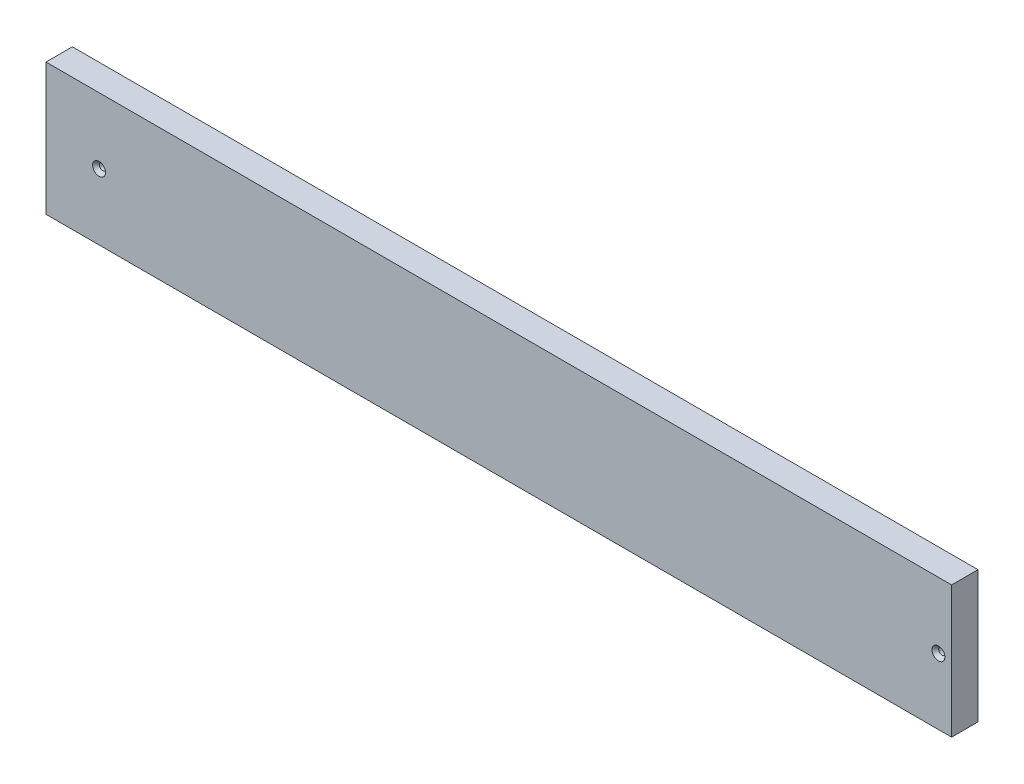
ISO-10303-21;
HEADER;
FILE_DESCRIPTION(('STEP AP214'),'2;1');
FILE_NAME('part.step','',(''),(''),'','','');
FILE_SCHEMA(('AUTOMOTIVE_DESIGN { 1 0 10303 214 1 1 1 1 }'));
ENDSEC;
DATA;
#1=APPLICATION_CONTEXT('core data for automotive mechanical design processes');
#2=APPLICATION_PROTOCOL_DEFINITION('international standard','automotive_design',2000,#1);
#3=PRODUCT_CONTEXT('',#1,'mechanical');
#4=PRODUCT('Part','Part','',(#3));
#5=PRODUCT_RELATED_PRODUCT_CATEGORY('part','',(#4));
#6=PRODUCT_DEFINITION_FORMATION('','',#4);
#7=PRODUCT_DEFINITION_CONTEXT('part definition',#1,'design');
#8=PRODUCT_DEFINITION('design','',#6,#7);
#9=PRODUCT_DEFINITION_SHAPE('','',#8);
#10=(LENGTH_UNIT() NAMED_UNIT(*) SI_UNIT(.MILLI.,.METRE.));
#11=(NAMED_UNIT(*) PLANE_ANGLE_UNIT() SI_UNIT($,.RADIAN.));
#12=(NAMED_UNIT(*) SI_UNIT($,.STERADIAN.) SOLID_ANGLE_UNIT());
#13=UNCERTAINTY_MEASURE_WITH_UNIT(LENGTH_MEASURE(1.E-05),#10,'distance_accuracy_value','');
#14=(GEOMETRIC_REPRESENTATION_CONTEXT(3) GLOBAL_UNCERTAINTY_ASSIGNED_CONTEXT((#13)) GLOBAL_UNIT_ASSIGNED_CONTEXT((#10,
#11,#12)) REPRESENTATION_CONTEXT('',''));
#15=CARTESIAN_POINT('',(0.,0.,0.));
#16=DIRECTION('',(0.,0.,1.));
#17=DIRECTION('',(1.,0.,0.));
#18=AXIS2_PLACEMENT_3D('',#15,#16,#17);
#19=CARTESIAN_POINT('',(0.,0.,15.));
#20=DIRECTION('',(1.,0.,0.));
#21=DIRECTION('',(0.,0.,-1.));
#22=AXIS2_PLACEMENT_3D('',#19,#20,#21);
#23=PLANE('',#22);
#24=DIRECTION('',(0.,-1.,0.));
#25=VECTOR('',#24,1.);
#26=CARTESIAN_POINT('',(0.,0.,0.));
#27=LINE('',#26,#25);
#28=CARTESIAN_POINT('',(0.,75.,0.));
#29=VERTEX_POINT('',#28);
#30=CARTESIAN_POINT('',(0.,0.,0.));
#31=VERTEX_POINT('',#30);
#32=EDGE_CURVE('E109',#29,#31,#27,.T.);
#33=ORIENTED_EDGE('',*,*,#32,.T.);
#34=DIRECTION('',(0.,0.,-1.));
#35=VECTOR('',#34,1.);
#36=CARTESIAN_POINT('',(0.,0.,15.));
#37=LINE('',#36,#35);
#38=CARTESIAN_POINT('',(0.,0.,15.));
#39=VERTEX_POINT('',#38);
#40=EDGE_CURVE('E11',#39,#31,#37,.T.);
#41=ORIENTED_EDGE('',*,*,#40,.F.);
#42=DIRECTION('',(0.,-1.,0.));
#43=VECTOR('',#42,1.);
#44=CARTESIAN_POINT('',(0.,0.,15.));
#45=LINE('',#44,#43);
#46=CARTESIAN_POINT('',(0.,75.,15.));
#47=VERTEX_POINT('',#46);
#48=EDGE_CURVE('E96',#47,#39,#45,.T.);
#49=ORIENTED_EDGE('',*,*,#48,.F.);
#50=DIRECTION('',(0.,0.,-1.));
#51=VECTOR('',#50,1.);
#52=CARTESIAN_POINT('',(0.,75.,15.));
#53=LINE('',#52,#51);
#54=EDGE_CURVE('E106',#47,#29,#53,.T.);
#55=ORIENTED_EDGE('',*,*,#54,.T.);
#56=EDGE_LOOP('',(#33,#41,#49,#55));
#57=FACE_BOUND('',#56,.T.);
#58=ADVANCED_FACE('F50',(#57),#23,.F.);
#59=CARTESIAN_POINT('',(0.,0.,15.));
#60=DIRECTION('',(0.,1.,0.));
#61=DIRECTION('',(0.,0.,1.));
#62=AXIS2_PLACEMENT_3D('',#59,#60,#61);
#63=PLANE('',#62);
#64=DIRECTION('',(1.,0.,0.));
#65=VECTOR('',#64,1.);
#66=CARTESIAN_POINT('',(0.,0.,0.));
#67=LINE('',#66,#65);
#68=CARTESIAN_POINT('',(515.,0.,0.));
#69=VERTEX_POINT('',#68);
#70=EDGE_CURVE('E105',#31,#69,#67,.T.);
#71=ORIENTED_EDGE('',*,*,#70,.T.);
#72=DIRECTION('',(0.,0.,-1.));
#73=VECTOR('',#72,1.);
#74=CARTESIAN_POINT('',(515.,0.,15.));
#75=LINE('',#74,#73);
#76=CARTESIAN_POINT('',(515.,0.,15.));
#77=VERTEX_POINT('',#76);
#78=EDGE_CURVE('E54',#77,#69,#75,.T.);
#79=ORIENTED_EDGE('',*,*,#78,.F.);
#80=DIRECTION('',(1.,0.,0.));
#81=VECTOR('',#80,1.);
#82=CARTESIAN_POINT('',(0.,0.,15.));
#83=LINE('',#82,#81);
#84=EDGE_CURVE('E94',#39,#77,#83,.T.);
#85=ORIENTED_EDGE('',*,*,#84,.F.);
#86=ORIENTED_EDGE('',*,*,#40,.T.);
#87=EDGE_LOOP('',(#71,#79,#85,#86));
#88=FACE_BOUND('',#87,.T.);
#89=ADVANCED_FACE('F103',(#88),#63,.F.);
#90=CARTESIAN_POINT('',(515.,0.,15.));
#91=DIRECTION('',(-1.,0.,0.));
#92=DIRECTION('',(0.,0.,1.));
#93=AXIS2_PLACEMENT_3D('',#90,#91,#92);
#94=PLANE('',#93);
#95=DIRECTION('',(0.,1.,0.));
#96=VECTOR('',#95,1.);
#97=CARTESIAN_POINT('',(515.,0.,0.));
#98=LINE('',#97,#96);
#99=CARTESIAN_POINT('',(515.,75.,0.));
#100=VERTEX_POINT('',#99);
#101=EDGE_CURVE('E78',#69,#100,#98,.T.);
#102=ORIENTED_EDGE('',*,*,#101,.T.);
#103=DIRECTION('',(0.,0.,-1.));
#104=VECTOR('',#103,1.);
#105=CARTESIAN_POINT('',(515.,75.,15.));
#106=LINE('',#105,#104);
#107=CARTESIAN_POINT('',(515.,75.,15.));
#108=VERTEX_POINT('',#107);
#109=EDGE_CURVE('E101',#108,#100,#106,.T.);
#110=ORIENTED_EDGE('',*,*,#109,.F.);
#111=DIRECTION('',(0.,1.,0.));
#112=VECTOR('',#111,1.);
#113=CARTESIAN_POINT('',(515.,0.,15.));
#114=LINE('',#113,#112);
#115=EDGE_CURVE('E98',#77,#108,#114,.T.);
#116=ORIENTED_EDGE('',*,*,#115,.F.);
#117=ORIENTED_EDGE('',*,*,#78,.T.);
#118=EDGE_LOOP('',(#102,#110,#116,#117));
#119=FACE_BOUND('',#118,.T.);
#120=ADVANCED_FACE('F104',(#119),#94,.F.);
#121=CARTESIAN_POINT('',(0.,75.,15.));
#122=DIRECTION('',(0.,-1.,0.));
#123=DIRECTION('',(0.,0.,-1.));
#124=AXIS2_PLACEMENT_3D('',#121,#122,#123);
#125=PLANE('',#124);
#126=DIRECTION('',(-1.,0.,0.));
#127=VECTOR('',#126,1.);
#128=CARTESIAN_POINT('',(0.,75.,0.));
#129=LINE('',#128,#127);
#130=EDGE_CURVE('E86',#100,#29,#129,.T.);
#131=ORIENTED_EDGE('',*,*,#130,.T.);
#132=ORIENTED_EDGE('',*,*,#54,.F.);
#133=DIRECTION('',(-1.,0.,0.));
#134=VECTOR('',#133,1.);
#135=CARTESIAN_POINT('',(0.,75.,15.));
#136=LINE('',#135,#134);
#137=EDGE_CURVE('E64',#108,#47,#136,.T.);
#138=ORIENTED_EDGE('',*,*,#137,.F.);
#139=ORIENTED_EDGE('',*,*,#109,.T.);
#140=EDGE_LOOP('',(#131,#132,#138,#139));
#141=FACE_BOUND('',#140,.T.);
#142=ADVANCED_FACE('F117',(#141),#125,.F.);
#143=CARTESIAN_POINT('',(0.,0.,15.));
#144=DIRECTION('',(0.,0.,-1.));
#145=DIRECTION('',(-1.,0.,0.));
#146=AXIS2_PLACEMENT_3D('',#143,#144,#145);
#147=PLANE('',#146);
#148=CARTESIAN_POINT('',(30.1944881079979,37.5,14.9999999999999));
#149=DIRECTION('',(0.,0.,1.));
#150=DIRECTION('',(1.,0.,0.));
#151=AXIS2_PLACEMENT_3D('',#148,#149,#150);
#152=CIRCLE('',#151,3.683);
#153=CARTESIAN_POINT('',(33.8774881079978,37.5,14.9999999999999));
#154=VERTEX_POINT('',#153);
#155=EDGE_CURVE('E139',#154,#154,#152,.T.);
#156=ORIENTED_EDGE('',*,*,#155,.F.);
#157=EDGE_LOOP('',(#156));
#158=FACE_BOUND('',#157,.T.);
#159=CARTESIAN_POINT('',(507.500000000004,37.5000000000001,14.9999999999999));
#160=DIRECTION('',(0.,0.,1.));
#161=DIRECTION('',(1.,0.,0.));
#162=AXIS2_PLACEMENT_3D('',#159,#160,#161);
#163=CIRCLE('',#162,3.68299999999999);
#164=CARTESIAN_POINT('',(511.183000000004,37.5000000000001,14.9999999999999));
#165=VERTEX_POINT('',#164);
#166=EDGE_CURVE('E126',#165,#165,#163,.T.);
#167=ORIENTED_EDGE('',*,*,#166,.F.);
#168=EDGE_LOOP('',(#167));
#169=FACE_BOUND('',#168,.T.);
#170=ORIENTED_EDGE('',*,*,#48,.T.);
#171=ORIENTED_EDGE('',*,*,#84,.T.);
#172=ORIENTED_EDGE('',*,*,#115,.T.);
#173=ORIENTED_EDGE('',*,*,#137,.T.);
#174=EDGE_LOOP('',(#170,#171,#172,#173));
#175=FACE_BOUND('',#174,.T.);
#176=ADVANCED_FACE('F93',(#158,#169,#175),#147,.F.);
#177=CARTESIAN_POINT('',(0.,0.,0.));
#178=DIRECTION('',(0.,0.,-1.));
#179=DIRECTION('',(-1.,0.,0.));
#180=AXIS2_PLACEMENT_3D('',#177,#178,#179);
#181=PLANE('',#180);
#182=CARTESIAN_POINT('',(30.1944881079979,37.5,0.));
#183=DIRECTION('',(0.,0.,1.));
#184=DIRECTION('',(1.,0.,0.));
#185=AXIS2_PLACEMENT_3D('',#182,#183,#184);
#186=CIRCLE('',#185,1.90499999999998);
#187=CARTESIAN_POINT('',(32.0994881079978,37.5,0.));
#188=VERTEX_POINT('',#187);
#189=EDGE_CURVE('E135',#188,#188,#186,.T.);
#190=ORIENTED_EDGE('',*,*,#189,.T.);
#191=EDGE_LOOP('',(#190));
#192=FACE_BOUND('',#191,.T.);
#193=CARTESIAN_POINT('',(507.500000000004,37.5000000000001,0.));
#194=DIRECTION('',(0.,0.,1.));
#195=DIRECTION('',(1.,0.,0.));
#196=AXIS2_PLACEMENT_3D('',#193,#194,#195);
#197=CIRCLE('',#196,1.90499999999993);
#198=CARTESIAN_POINT('',(509.405000000004,37.5000000000001,0.));
#199=VERTEX_POINT('',#198);
#200=EDGE_CURVE('E113',#199,#199,#197,.T.);
#201=ORIENTED_EDGE('',*,*,#200,.T.);
#202=EDGE_LOOP('',(#201));
#203=FACE_BOUND('',#202,.T.);
#204=ORIENTED_EDGE('',*,*,#32,.F.);
#205=ORIENTED_EDGE('',*,*,#130,.F.);
#206=ORIENTED_EDGE('',*,*,#101,.F.);
#207=ORIENTED_EDGE('',*,*,#70,.F.);
#208=EDGE_LOOP('',(#204,#205,#206,#207));
#209=FACE_BOUND('',#208,.T.);
#210=ADVANCED_FACE('F122',(#192,#203,#209),#181,.T.);
#211=CARTESIAN_POINT('',(507.500000000004,37.5000000000001,14.9999999999999));
#212=DIRECTION('',(0.,0.,1.));
#213=DIRECTION('',(1.,0.,0.));
#214=AXIS2_PLACEMENT_3D('',#211,#212,#213);
#215=CYLINDRICAL_SURFACE('',#214,1.90499999999993);
#216=ORIENTED_EDGE('',*,*,#200,.F.);
#217=EDGE_LOOP('',(#216));
#218=FACE_BOUND('',#217,.T.);
#219=CARTESIAN_POINT('',(507.500000000004,37.5000000000001,12.9546449719609));
#220=DIRECTION('',(0.,0.,1.));
#221=DIRECTION('',(1.,0.,0.));
#222=AXIS2_PLACEMENT_3D('',#219,#220,#221);
#223=CIRCLE('',#222,1.90499999999993);
#224=CARTESIAN_POINT('',(509.405000000004,37.5000000000001,12.9546449719609));
#225=VERTEX_POINT('',#224);
#226=EDGE_CURVE('E127',#225,#225,#223,.T.);
#227=ORIENTED_EDGE('',*,*,#226,.T.);
#228=EDGE_LOOP('',(#227));
#229=FACE_BOUND('',#228,.T.);
#230=ADVANCED_FACE('F155',(#218,#229),#215,.F.);
#231=CARTESIAN_POINT('',(507.500000000004,37.5000000000001,14.9999999999999));
#232=DIRECTION('',(0.,0.,1.));
#233=DIRECTION('',(1.,0.,0.));
#234=AXIS2_PLACEMENT_3D('',#231,#232,#233);
#235=CONICAL_SURFACE('',#234,3.68299999999999,0.71558499331769);
#236=ORIENTED_EDGE('',*,*,#226,.F.);
#237=EDGE_LOOP('',(#236));
#238=FACE_BOUND('',#237,.T.);
#239=ORIENTED_EDGE('',*,*,#166,.T.);
#240=EDGE_LOOP('',(#239));
#241=FACE_BOUND('',#240,.T.);
#242=ADVANCED_FACE('F146',(#238,#241),#235,.F.);
#243=CARTESIAN_POINT('',(30.1944881079979,37.5,14.9999999999999));
#244=DIRECTION('',(0.,0.,1.));
#245=DIRECTION('',(1.,0.,0.));
#246=AXIS2_PLACEMENT_3D('',#243,#244,#245);
#247=CYLINDRICAL_SURFACE('',#246,1.90499999999999);
#248=ORIENTED_EDGE('',*,*,#189,.F.);
#249=EDGE_LOOP('',(#248));
#250=FACE_BOUND('',#249,.T.);
#251=CARTESIAN_POINT('',(30.1944881079979,37.5,12.9546449719609));
#252=DIRECTION('',(0.,0.,1.));
#253=DIRECTION('',(1.,0.,0.));
#254=AXIS2_PLACEMENT_3D('',#251,#252,#253);
#255=CIRCLE('',#254,1.90499999999999);
#256=CARTESIAN_POINT('',(32.0994881079978,37.5,12.9546449719609));
#257=VERTEX_POINT('',#256);
#258=EDGE_CURVE('E134',#257,#257,#255,.T.);
#259=ORIENTED_EDGE('',*,*,#258,.T.);
#260=EDGE_LOOP('',(#259));
#261=FACE_BOUND('',#260,.T.);
#262=ADVANCED_FACE('F151',(#250,#261),#247,.F.);
#263=CARTESIAN_POINT('',(30.1944881079979,37.5,14.9999999999999));
#264=DIRECTION('',(0.,0.,1.));
#265=DIRECTION('',(1.,0.,0.));
#266=AXIS2_PLACEMENT_3D('',#263,#264,#265);
#267=CONICAL_SURFACE('',#266,3.683,0.715584993317676);
#268=ORIENTED_EDGE('',*,*,#258,.F.);
#269=EDGE_LOOP('',(#268));
#270=FACE_BOUND('',#269,.T.);
#271=ORIENTED_EDGE('',*,*,#155,.T.);
#272=EDGE_LOOP('',(#271));
#273=FACE_BOUND('',#272,.T.);
#274=ADVANCED_FACE('F145',(#270,#273),#267,.F.);
#275=CLOSED_SHELL('',(#58,#89,#120,#142,#176,#210,#230,#242,#262,#274));
#276=MANIFOLD_SOLID_BREP('B2',#275);
#277=ADVANCED_BREP_SHAPE_REPRESENTATION('',(#18,#276),#14);
#278=SHAPE_DEFINITION_REPRESENTATION(#9,#277);
ENDSEC;
END-ISO-10303-21;
